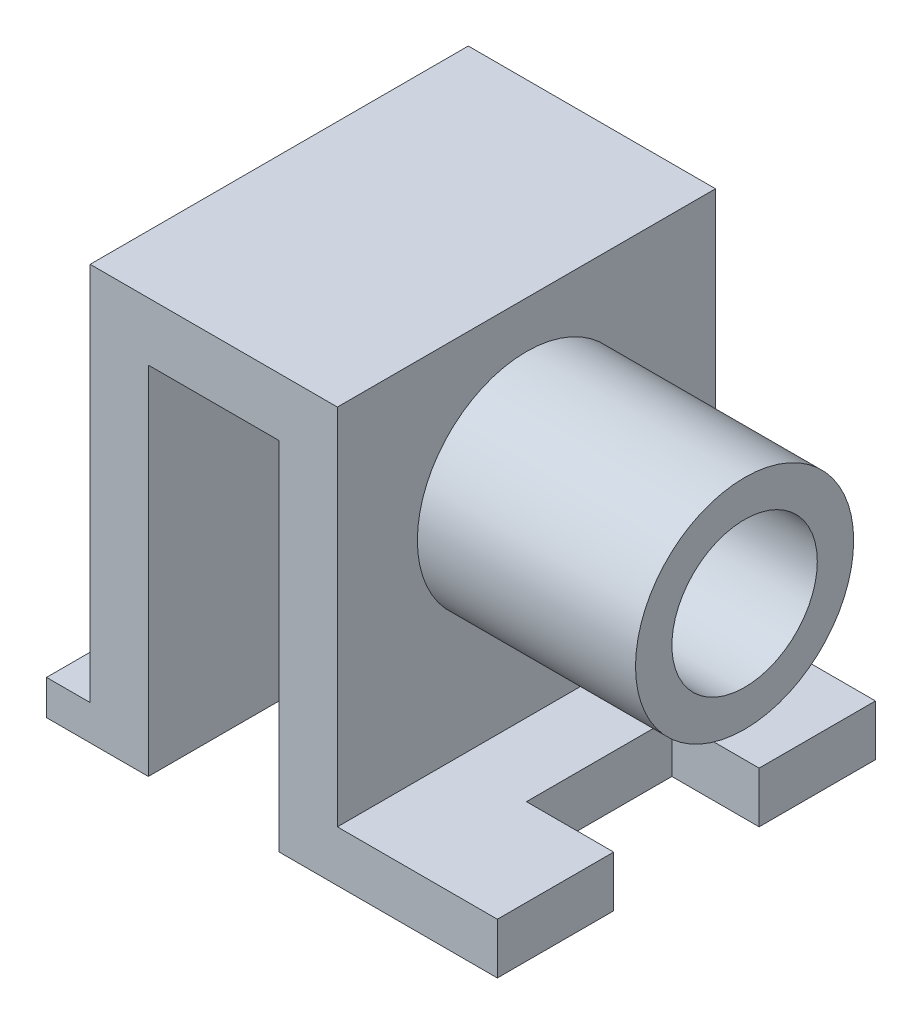
ISO-10303-21;
HEADER;
FILE_DESCRIPTION(('STEP AP214'),'2;1');
FILE_NAME('part.step','',(''),(''),'','','');
FILE_SCHEMA(('AUTOMOTIVE_DESIGN { 1 0 10303 214 1 1 1 1 }'));
ENDSEC;
DATA;
#1=APPLICATION_CONTEXT('core data for automotive mechanical design processes');
#2=APPLICATION_PROTOCOL_DEFINITION('international standard','automotive_design',2000,#1);
#3=PRODUCT_CONTEXT('',#1,'mechanical');
#4=PRODUCT('Part','Part','',(#3));
#5=PRODUCT_RELATED_PRODUCT_CATEGORY('part','',(#4));
#6=PRODUCT_DEFINITION_FORMATION('','',#4);
#7=PRODUCT_DEFINITION_CONTEXT('part definition',#1,'design');
#8=PRODUCT_DEFINITION('design','',#6,#7);
#9=PRODUCT_DEFINITION_SHAPE('','',#8);
#10=(LENGTH_UNIT() NAMED_UNIT(*) SI_UNIT(.MILLI.,.METRE.));
#11=(NAMED_UNIT(*) PLANE_ANGLE_UNIT() SI_UNIT($,.RADIAN.));
#12=(NAMED_UNIT(*) SI_UNIT($,.STERADIAN.) SOLID_ANGLE_UNIT());
#13=UNCERTAINTY_MEASURE_WITH_UNIT(LENGTH_MEASURE(1.E-05),#10,'distance_accuracy_value','');
#14=(GEOMETRIC_REPRESENTATION_CONTEXT(3) GLOBAL_UNCERTAINTY_ASSIGNED_CONTEXT((#13)) GLOBAL_UNIT_ASSIGNED_CONTEXT((#10,
#11,#12)) REPRESENTATION_CONTEXT('',''));
#15=CARTESIAN_POINT('',(0.,0.,0.));
#16=DIRECTION('',(0.,0.,1.));
#17=DIRECTION('',(1.,0.,0.));
#18=AXIS2_PLACEMENT_3D('',#15,#16,#17);
#19=CARTESIAN_POINT('',(62.,0.,26.));
#20=DIRECTION('',(-1.,0.,0.));
#21=DIRECTION('',(0.,0.,1.));
#22=AXIS2_PLACEMENT_3D('',#19,#20,#21);
#23=PLANE('',#22);
#24=DIRECTION('',(0.,0.,-1.));
#25=VECTOR('',#24,1.);
#26=CARTESIAN_POINT('',(62.,0.,26.));
#27=LINE('',#26,#25);
#28=CARTESIAN_POINT('',(62.,0.,26.));
#29=VERTEX_POINT('',#28);
#30=CARTESIAN_POINT('',(62.,0.,10.));
#31=VERTEX_POINT('',#30);
#32=EDGE_CURVE('E211',#29,#31,#27,.T.);
#33=ORIENTED_EDGE('',*,*,#32,.T.);
#34=DIRECTION('',(0.,1.,0.));
#35=VECTOR('',#34,1.);
#36=CARTESIAN_POINT('',(62.,0.,10.));
#37=LINE('',#36,#35);
#38=CARTESIAN_POINT('',(62.,7.,10.));
#39=VERTEX_POINT('',#38);
#40=EDGE_CURVE('E177',#31,#39,#37,.T.);
#41=ORIENTED_EDGE('',*,*,#40,.T.);
#42=DIRECTION('',(0.,0.,-1.));
#43=VECTOR('',#42,1.);
#44=CARTESIAN_POINT('',(62.,7.,26.));
#45=LINE('',#44,#43);
#46=CARTESIAN_POINT('',(62.,7.,26.));
#47=VERTEX_POINT('',#46);
#48=EDGE_CURVE('E207',#47,#39,#45,.T.);
#49=ORIENTED_EDGE('',*,*,#48,.F.);
#50=DIRECTION('',(0.,1.,0.));
#51=VECTOR('',#50,1.);
#52=CARTESIAN_POINT('',(62.,0.,26.));
#53=LINE('',#52,#51);
#54=EDGE_CURVE('E254',#29,#47,#53,.T.);
#55=ORIENTED_EDGE('',*,*,#54,.F.);
#56=EDGE_LOOP('',(#33,#41,#49,#55));
#57=FACE_BOUND('',#56,.T.);
#58=ADVANCED_FACE('F39',(#57),#23,.F.);
#59=CARTESIAN_POINT('',(0.,4.80451127819548,26.));
#60=DIRECTION('',(1.,0.,0.));
#61=DIRECTION('',(0.,0.,-1.));
#62=AXIS2_PLACEMENT_3D('',#59,#60,#61);
#63=PLANE('',#62);
#64=DIRECTION('',(0.,-1.,0.));
#65=VECTOR('',#64,1.);
#66=CARTESIAN_POINT('',(0.,4.80451127819548,-26.));
#67=LINE('',#66,#65);
#68=CARTESIAN_POINT('',(0.,4.80451127819548,-26.));
#69=VERTEX_POINT('',#68);
#70=CARTESIAN_POINT('',(0.,0.,-26.));
#71=VERTEX_POINT('',#70);
#72=EDGE_CURVE('E173',#69,#71,#67,.T.);
#73=ORIENTED_EDGE('',*,*,#72,.T.);
#74=DIRECTION('',(0.,0.,-1.));
#75=VECTOR('',#74,1.);
#76=CARTESIAN_POINT('',(0.,0.,26.));
#77=LINE('',#76,#75);
#78=CARTESIAN_POINT('',(0.,0.,26.));
#79=VERTEX_POINT('',#78);
#80=EDGE_CURVE('E47',#79,#71,#77,.T.);
#81=ORIENTED_EDGE('',*,*,#80,.F.);
#82=DIRECTION('',(0.,-1.,0.));
#83=VECTOR('',#82,1.);
#84=CARTESIAN_POINT('',(0.,4.80451127819548,26.));
#85=LINE('',#84,#83);
#86=CARTESIAN_POINT('',(0.,4.80451127819548,26.));
#87=VERTEX_POINT('',#86);
#88=EDGE_CURVE('E199',#87,#79,#85,.T.);
#89=ORIENTED_EDGE('',*,*,#88,.F.);
#90=DIRECTION('',(0.,0.,-1.));
#91=VECTOR('',#90,1.);
#92=CARTESIAN_POINT('',(0.,4.80451127819548,26.));
#93=LINE('',#92,#91);
#94=EDGE_CURVE('E169',#87,#69,#93,.T.);
#95=ORIENTED_EDGE('',*,*,#94,.T.);
#96=EDGE_LOOP('',(#73,#81,#89,#95));
#97=FACE_BOUND('',#96,.T.);
#98=ADVANCED_FACE('F41',(#97),#63,.F.);
#99=CARTESIAN_POINT('',(0.,0.,26.));
#100=DIRECTION('',(0.,1.,0.));
#101=DIRECTION('',(-1.,0.,0.));
#102=AXIS2_PLACEMENT_3D('',#99,#100,#101);
#103=PLANE('',#102);
#104=DIRECTION('',(1.,0.,0.));
#105=VECTOR('',#104,1.);
#106=CARTESIAN_POINT('',(0.,0.,-26.));
#107=LINE('',#106,#105);
#108=CARTESIAN_POINT('',(14.,0.,-26.));
#109=VERTEX_POINT('',#108);
#110=EDGE_CURVE('E176',#71,#109,#107,.T.);
#111=ORIENTED_EDGE('',*,*,#110,.T.);
#112=DIRECTION('',(0.,0.,-1.));
#113=VECTOR('',#112,1.);
#114=CARTESIAN_POINT('',(14.,0.,26.));
#115=LINE('',#114,#113);
#116=CARTESIAN_POINT('',(14.,0.,26.));
#117=VERTEX_POINT('',#116);
#118=EDGE_CURVE('E223',#117,#109,#115,.T.);
#119=ORIENTED_EDGE('',*,*,#118,.F.);
#120=DIRECTION('',(1.,0.,0.));
#121=VECTOR('',#120,1.);
#122=CARTESIAN_POINT('',(0.,0.,26.));
#123=LINE('',#122,#121);
#124=EDGE_CURVE('E117',#79,#117,#123,.T.);
#125=ORIENTED_EDGE('',*,*,#124,.F.);
#126=ORIENTED_EDGE('',*,*,#80,.T.);
#127=EDGE_LOOP('',(#111,#119,#125,#126));
#128=FACE_BOUND('',#127,.T.);
#129=ADVANCED_FACE('F226',(#128),#103,.F.);
#130=CARTESIAN_POINT('',(14.,0.,26.));
#131=DIRECTION('',(-1.,0.,0.));
#132=DIRECTION('',(0.,0.,1.));
#133=AXIS2_PLACEMENT_3D('',#130,#131,#132);
#134=PLANE('',#133);
#135=DIRECTION('',(0.,1.,0.));
#136=VECTOR('',#135,1.);
#137=CARTESIAN_POINT('',(14.,0.,-26.));
#138=LINE('',#137,#136);
#139=CARTESIAN_POINT('',(14.,49.,-26.));
#140=VERTEX_POINT('',#139);
#141=EDGE_CURVE('E179',#109,#140,#138,.T.);
#142=ORIENTED_EDGE('',*,*,#141,.T.);
#143=DIRECTION('',(0.,0.,-1.));
#144=VECTOR('',#143,1.);
#145=CARTESIAN_POINT('',(14.,49.,26.));
#146=LINE('',#145,#144);
#147=CARTESIAN_POINT('',(14.,49.,26.));
#148=VERTEX_POINT('',#147);
#149=EDGE_CURVE('E220',#148,#140,#146,.T.);
#150=ORIENTED_EDGE('',*,*,#149,.F.);
#151=DIRECTION('',(0.,1.,0.));
#152=VECTOR('',#151,1.);
#153=CARTESIAN_POINT('',(14.,0.,26.));
#154=LINE('',#153,#152);
#155=EDGE_CURVE('E246',#117,#148,#154,.T.);
#156=ORIENTED_EDGE('',*,*,#155,.F.);
#157=ORIENTED_EDGE('',*,*,#118,.T.);
#158=EDGE_LOOP('',(#142,#150,#156,#157));
#159=FACE_BOUND('',#158,.T.);
#160=ADVANCED_FACE('F237',(#159),#134,.F.);
#161=CARTESIAN_POINT('',(14.,49.,26.));
#162=DIRECTION('',(0.,1.,0.));
#163=DIRECTION('',(0.,0.,1.));
#164=AXIS2_PLACEMENT_3D('',#161,#162,#163);
#165=PLANE('',#164);
#166=DIRECTION('',(1.,0.,0.));
#167=VECTOR('',#166,1.);
#168=CARTESIAN_POINT('',(14.,49.,-26.));
#169=LINE('',#168,#167);
#170=CARTESIAN_POINT('',(32.,49.,-26.));
#171=VERTEX_POINT('',#170);
#172=EDGE_CURVE('E181',#140,#171,#169,.T.);
#173=ORIENTED_EDGE('',*,*,#172,.T.);
#174=DIRECTION('',(0.,0.,-1.));
#175=VECTOR('',#174,1.);
#176=CARTESIAN_POINT('',(32.,49.,26.));
#177=LINE('',#176,#175);
#178=CARTESIAN_POINT('',(32.,49.,26.));
#179=VERTEX_POINT('',#178);
#180=EDGE_CURVE('E217',#179,#171,#177,.T.);
#181=ORIENTED_EDGE('',*,*,#180,.F.);
#182=DIRECTION('',(1.,0.,0.));
#183=VECTOR('',#182,1.);
#184=CARTESIAN_POINT('',(14.,49.,26.));
#185=LINE('',#184,#183);
#186=EDGE_CURVE('E243',#148,#179,#185,.T.);
#187=ORIENTED_EDGE('',*,*,#186,.F.);
#188=ORIENTED_EDGE('',*,*,#149,.T.);
#189=EDGE_LOOP('',(#173,#181,#187,#188));
#190=FACE_BOUND('',#189,.T.);
#191=ADVANCED_FACE('F241',(#190),#165,.F.);
#192=CARTESIAN_POINT('',(32.,49.,26.));
#193=DIRECTION('',(1.,0.,0.));
#194=DIRECTION('',(0.,1.,0.));
#195=AXIS2_PLACEMENT_3D('',#192,#193,#194);
#196=PLANE('',#195);
#197=DIRECTION('',(0.,-1.,0.));
#198=VECTOR('',#197,1.);
#199=CARTESIAN_POINT('',(32.,49.,-26.));
#200=LINE('',#199,#198);
#201=CARTESIAN_POINT('',(32.,0.,-26.));
#202=VERTEX_POINT('',#201);
#203=EDGE_CURVE('E183',#171,#202,#200,.T.);
#204=ORIENTED_EDGE('',*,*,#203,.T.);
#205=DIRECTION('',(0.,0.,-1.));
#206=VECTOR('',#205,1.);
#207=CARTESIAN_POINT('',(32.,0.,26.));
#208=LINE('',#207,#206);
#209=CARTESIAN_POINT('',(32.,0.,26.));
#210=VERTEX_POINT('',#209);
#211=EDGE_CURVE('E214',#210,#202,#208,.T.);
#212=ORIENTED_EDGE('',*,*,#211,.F.);
#213=DIRECTION('',(0.,-1.,0.));
#214=VECTOR('',#213,1.);
#215=CARTESIAN_POINT('',(32.,49.,26.));
#216=LINE('',#215,#214);
#217=EDGE_CURVE('E245',#179,#210,#216,.T.);
#218=ORIENTED_EDGE('',*,*,#217,.F.);
#219=ORIENTED_EDGE('',*,*,#180,.T.);
#220=EDGE_LOOP('',(#204,#212,#218,#219));
#221=FACE_BOUND('',#220,.T.);
#222=ADVANCED_FACE('F342',(#221),#196,.F.);
#223=CARTESIAN_POINT('',(32.,0.,26.));
#224=DIRECTION('',(0.,1.,0.));
#225=DIRECTION('',(-1.,0.,0.));
#226=AXIS2_PLACEMENT_3D('',#223,#224,#225);
#227=PLANE('',#226);
#228=DIRECTION('',(0.,0.,1.));
#229=VECTOR('',#228,1.);
#230=CARTESIAN_POINT('',(50.,0.,-10.));
#231=LINE('',#230,#229);
#232=CARTESIAN_POINT('',(50.,0.,-10.));
#233=VERTEX_POINT('',#232);
#234=CARTESIAN_POINT('',(50.,0.,10.));
#235=VERTEX_POINT('',#234);
#236=EDGE_CURVE('E292',#233,#235,#231,.T.);
#237=ORIENTED_EDGE('',*,*,#236,.T.);
#238=DIRECTION('',(1.,0.,0.));
#239=VECTOR('',#238,1.);
#240=CARTESIAN_POINT('',(50.,0.,10.));
#241=LINE('',#240,#239);
#242=EDGE_CURVE('E272',#235,#31,#241,.T.);
#243=ORIENTED_EDGE('',*,*,#242,.T.);
#244=ORIENTED_EDGE('',*,*,#32,.F.);
#245=DIRECTION('',(1.,0.,0.));
#246=VECTOR('',#245,1.);
#247=CARTESIAN_POINT('',(32.,0.,26.));
#248=LINE('',#247,#246);
#249=EDGE_CURVE('E248',#210,#29,#248,.T.);
#250=ORIENTED_EDGE('',*,*,#249,.F.);
#251=ORIENTED_EDGE('',*,*,#211,.T.);
#252=DIRECTION('',(1.,0.,0.));
#253=VECTOR('',#252,1.);
#254=CARTESIAN_POINT('',(32.,0.,-26.));
#255=LINE('',#254,#253);
#256=CARTESIAN_POINT('',(62.,0.,-26.));
#257=VERTEX_POINT('',#256);
#258=EDGE_CURVE('E185',#202,#257,#255,.T.);
#259=ORIENTED_EDGE('',*,*,#258,.T.);
#260=CARTESIAN_POINT('',(62.,0.,-10.));
#261=VERTEX_POINT('',#260);
#262=EDGE_CURVE('E210',#261,#257,#27,.T.);
#263=ORIENTED_EDGE('',*,*,#262,.F.);
#264=DIRECTION('',(-1.,0.,0.));
#265=VECTOR('',#264,1.);
#266=CARTESIAN_POINT('',(62.,0.,-10.));
#267=LINE('',#266,#265);
#268=EDGE_CURVE('E283',#261,#233,#267,.T.);
#269=ORIENTED_EDGE('',*,*,#268,.T.);
#270=EDGE_LOOP('',(#237,#243,#244,#250,#251,#259,#263,#269));
#271=FACE_BOUND('',#270,.T.);
#272=ADVANCED_FACE('F337',(#271),#227,.F.);
#273=CARTESIAN_POINT('',(62.,7.,-9.99999999999998));
#274=VERTEX_POINT('',#273);
#275=CARTESIAN_POINT('',(62.,7.,-26.));
#276=VERTEX_POINT('',#275);
#277=EDGE_CURVE('E206',#274,#276,#45,.T.);
#278=ORIENTED_EDGE('',*,*,#277,.F.);
#279=DIRECTION('',(0.,1.,0.));
#280=VECTOR('',#279,1.);
#281=CARTESIAN_POINT('',(62.,0.,-10.));
#282=LINE('',#281,#280);
#283=EDGE_CURVE('E54',#261,#274,#282,.T.);
#284=ORIENTED_EDGE('',*,*,#283,.F.);
#285=ORIENTED_EDGE('',*,*,#262,.T.);
#286=DIRECTION('',(0.,1.,0.));
#287=VECTOR('',#286,1.);
#288=CARTESIAN_POINT('',(62.,0.,-26.));
#289=LINE('',#288,#287);
#290=EDGE_CURVE('E188',#257,#276,#289,.T.);
#291=ORIENTED_EDGE('',*,*,#290,.T.);
#292=EDGE_LOOP('',(#278,#284,#285,#291));
#293=FACE_BOUND('',#292,.T.);
#294=ADVANCED_FACE('F328',(#293),#23,.F.);
#295=CARTESIAN_POINT('',(62.,7.,26.));
#296=DIRECTION('',(0.,-1.,0.));
#297=DIRECTION('',(1.,0.,0.));
#298=AXIS2_PLACEMENT_3D('',#295,#296,#297);
#299=PLANE('',#298);
#300=ORIENTED_EDGE('',*,*,#48,.T.);
#301=DIRECTION('',(1.,0.,0.));
#302=VECTOR('',#301,1.);
#303=CARTESIAN_POINT('',(50.,7.,10.));
#304=LINE('',#303,#302);
#305=CARTESIAN_POINT('',(50.,7.,10.));
#306=VERTEX_POINT('',#305);
#307=EDGE_CURVE('E280',#306,#39,#304,.T.);
#308=ORIENTED_EDGE('',*,*,#307,.F.);
#309=DIRECTION('',(0.,0.,1.));
#310=VECTOR('',#309,1.);
#311=CARTESIAN_POINT('',(50.,7.,-10.));
#312=LINE('',#311,#310);
#313=CARTESIAN_POINT('',(50.,7.,-10.));
#314=VERTEX_POINT('',#313);
#315=EDGE_CURVE('E284',#314,#306,#312,.T.);
#316=ORIENTED_EDGE('',*,*,#315,.F.);
#317=DIRECTION('',(-1.,0.,0.));
#318=VECTOR('',#317,1.);
#319=CARTESIAN_POINT('',(62.,7.,-10.));
#320=LINE('',#319,#318);
#321=EDGE_CURVE('E287',#274,#314,#320,.T.);
#322=ORIENTED_EDGE('',*,*,#321,.F.);
#323=ORIENTED_EDGE('',*,*,#277,.T.);
#324=DIRECTION('',(-1.,0.,0.));
#325=VECTOR('',#324,1.);
#326=CARTESIAN_POINT('',(62.,7.,-26.));
#327=LINE('',#326,#325);
#328=CARTESIAN_POINT('',(40.,7.,-26.));
#329=VERTEX_POINT('',#328);
#330=EDGE_CURVE('E191',#276,#329,#327,.T.);
#331=ORIENTED_EDGE('',*,*,#330,.T.);
#332=DIRECTION('',(0.,0.,-1.));
#333=VECTOR('',#332,1.);
#334=CARTESIAN_POINT('',(40.,7.,26.));
#335=LINE('',#334,#333);
#336=CARTESIAN_POINT('',(40.,7.,26.));
#337=VERTEX_POINT('',#336);
#338=EDGE_CURVE('E203',#337,#329,#335,.T.);
#339=ORIENTED_EDGE('',*,*,#338,.F.);
#340=DIRECTION('',(-1.,0.,0.));
#341=VECTOR('',#340,1.);
#342=CARTESIAN_POINT('',(62.,7.,26.));
#343=LINE('',#342,#341);
#344=EDGE_CURVE('E256',#47,#337,#343,.T.);
#345=ORIENTED_EDGE('',*,*,#344,.F.);
#346=EDGE_LOOP('',(#300,#308,#316,#322,#323,#331,#339,#345));
#347=FACE_BOUND('',#346,.T.);
#348=ADVANCED_FACE('F262',(#347),#299,.F.);
#349=CARTESIAN_POINT('',(40.,7.,26.));
#350=DIRECTION('',(-1.,0.,0.));
#351=DIRECTION('',(0.,0.,1.));
#352=AXIS2_PLACEMENT_3D('',#349,#350,#351);
#353=PLANE('',#352);
#354=CARTESIAN_POINT('',(40.,35.6099255133953,0.));
#355=DIRECTION('',(-1.,0.,0.));
#356=DIRECTION('',(0.,0.,1.));
#357=AXIS2_PLACEMENT_3D('',#354,#355,#356);
#358=CIRCLE('',#357,15.);
#359=CARTESIAN_POINT('',(40.,35.6099255133953,15.));
#360=VERTEX_POINT('',#359);
#361=EDGE_CURVE('E11',#360,#360,#358,.F.);
#362=ORIENTED_EDGE('',*,*,#361,.F.);
#363=EDGE_LOOP('',(#362));
#364=FACE_BOUND('',#363,.T.);
#365=DIRECTION('',(0.,1.,0.));
#366=VECTOR('',#365,1.);
#367=CARTESIAN_POINT('',(40.,7.,-26.));
#368=LINE('',#367,#366);
#369=CARTESIAN_POINT('',(40.,57.,-26.));
#370=VERTEX_POINT('',#369);
#371=EDGE_CURVE('E193',#329,#370,#368,.T.);
#372=ORIENTED_EDGE('',*,*,#371,.T.);
#373=DIRECTION('',(0.,0.,-1.));
#374=VECTOR('',#373,1.);
#375=CARTESIAN_POINT('',(40.,57.,26.));
#376=LINE('',#375,#374);
#377=CARTESIAN_POINT('',(40.,57.,26.));
#378=VERTEX_POINT('',#377);
#379=EDGE_CURVE('E164',#378,#370,#376,.T.);
#380=ORIENTED_EDGE('',*,*,#379,.F.);
#381=DIRECTION('',(0.,1.,0.));
#382=VECTOR('',#381,1.);
#383=CARTESIAN_POINT('',(40.,7.,26.));
#384=LINE('',#383,#382);
#385=EDGE_CURVE('E152',#337,#378,#384,.T.);
#386=ORIENTED_EDGE('',*,*,#385,.F.);
#387=ORIENTED_EDGE('',*,*,#338,.T.);
#388=EDGE_LOOP('',(#372,#380,#386,#387));
#389=FACE_BOUND('',#388,.T.);
#390=ADVANCED_FACE('F266',(#364,#389),#353,.F.);
#391=CARTESIAN_POINT('',(40.,57.,26.));
#392=DIRECTION('',(0.,-1.,0.));
#393=DIRECTION('',(0.,0.,-1.));
#394=AXIS2_PLACEMENT_3D('',#391,#392,#393);
#395=PLANE('',#394);
#396=DIRECTION('',(-1.,0.,0.));
#397=VECTOR('',#396,1.);
#398=CARTESIAN_POINT('',(40.,57.,-26.));
#399=LINE('',#398,#397);
#400=CARTESIAN_POINT('',(6.,57.,-26.));
#401=VERTEX_POINT('',#400);
#402=EDGE_CURVE('E161',#370,#401,#399,.T.);
#403=ORIENTED_EDGE('',*,*,#402,.T.);
#404=DIRECTION('',(0.,0.,-1.));
#405=VECTOR('',#404,1.);
#406=CARTESIAN_POINT('',(6.,57.,26.));
#407=LINE('',#406,#405);
#408=CARTESIAN_POINT('',(6.,57.,26.));
#409=VERTEX_POINT('',#408);
#410=EDGE_CURVE('E158',#409,#401,#407,.T.);
#411=ORIENTED_EDGE('',*,*,#410,.F.);
#412=DIRECTION('',(-1.,0.,0.));
#413=VECTOR('',#412,1.);
#414=CARTESIAN_POINT('',(40.,57.,26.));
#415=LINE('',#414,#413);
#416=EDGE_CURVE('E145',#378,#409,#415,.T.);
#417=ORIENTED_EDGE('',*,*,#416,.F.);
#418=ORIENTED_EDGE('',*,*,#379,.T.);
#419=EDGE_LOOP('',(#403,#411,#417,#418));
#420=FACE_BOUND('',#419,.T.);
#421=ADVANCED_FACE('F159',(#420),#395,.F.);
#422=CARTESIAN_POINT('',(6.,57.,26.));
#423=DIRECTION('',(1.,0.,0.));
#424=DIRECTION('',(0.,1.,0.));
#425=AXIS2_PLACEMENT_3D('',#422,#423,#424);
#426=PLANE('',#425);
#427=DIRECTION('',(0.,-1.,0.));
#428=VECTOR('',#427,1.);
#429=CARTESIAN_POINT('',(6.,57.,-26.));
#430=LINE('',#429,#428);
#431=CARTESIAN_POINT('',(6.,4.80451127819548,-26.));
#432=VERTEX_POINT('',#431);
#433=EDGE_CURVE('E196',#401,#432,#430,.T.);
#434=ORIENTED_EDGE('',*,*,#433,.T.);
#435=DIRECTION('',(0.,0.,-1.));
#436=VECTOR('',#435,1.);
#437=CARTESIAN_POINT('',(6.,4.80451127819548,26.));
#438=LINE('',#437,#436);
#439=CARTESIAN_POINT('',(6.,4.80451127819548,26.));
#440=VERTEX_POINT('',#439);
#441=EDGE_CURVE('E165',#440,#432,#438,.T.);
#442=ORIENTED_EDGE('',*,*,#441,.F.);
#443=DIRECTION('',(0.,-1.,0.));
#444=VECTOR('',#443,1.);
#445=CARTESIAN_POINT('',(6.,57.,26.));
#446=LINE('',#445,#444);
#447=EDGE_CURVE('E149',#409,#440,#446,.T.);
#448=ORIENTED_EDGE('',*,*,#447,.F.);
#449=ORIENTED_EDGE('',*,*,#410,.T.);
#450=EDGE_LOOP('',(#434,#442,#448,#449));
#451=FACE_BOUND('',#450,.T.);
#452=ADVANCED_FACE('F167',(#451),#426,.F.);
#453=CARTESIAN_POINT('',(6.,4.80451127819548,26.));
#454=DIRECTION('',(0.,-1.,0.));
#455=DIRECTION('',(0.,0.,-1.));
#456=AXIS2_PLACEMENT_3D('',#453,#454,#455);
#457=PLANE('',#456);
#458=DIRECTION('',(-1.,0.,0.));
#459=VECTOR('',#458,1.);
#460=CARTESIAN_POINT('',(6.,4.80451127819548,-26.));
#461=LINE('',#460,#459);
#462=EDGE_CURVE('E108',#432,#69,#461,.T.);
#463=ORIENTED_EDGE('',*,*,#462,.T.);
#464=ORIENTED_EDGE('',*,*,#94,.F.);
#465=DIRECTION('',(-1.,0.,0.));
#466=VECTOR('',#465,1.);
#467=CARTESIAN_POINT('',(6.,4.80451127819548,26.));
#468=LINE('',#467,#466);
#469=EDGE_CURVE('E63',#440,#87,#468,.T.);
#470=ORIENTED_EDGE('',*,*,#469,.F.);
#471=ORIENTED_EDGE('',*,*,#441,.T.);
#472=EDGE_LOOP('',(#463,#464,#470,#471));
#473=FACE_BOUND('',#472,.T.);
#474=ADVANCED_FACE('F267',(#473),#457,.F.);
#475=CARTESIAN_POINT('',(0.,0.,26.));
#476=DIRECTION('',(0.,0.,1.));
#477=DIRECTION('',(1.,0.,0.));
#478=AXIS2_PLACEMENT_3D('',#475,#476,#477);
#479=PLANE('',#478);
#480=ORIENTED_EDGE('',*,*,#88,.T.);
#481=ORIENTED_EDGE('',*,*,#124,.T.);
#482=ORIENTED_EDGE('',*,*,#155,.T.);
#483=ORIENTED_EDGE('',*,*,#186,.T.);
#484=ORIENTED_EDGE('',*,*,#217,.T.);
#485=ORIENTED_EDGE('',*,*,#249,.T.);
#486=ORIENTED_EDGE('',*,*,#54,.T.);
#487=ORIENTED_EDGE('',*,*,#344,.T.);
#488=ORIENTED_EDGE('',*,*,#385,.T.);
#489=ORIENTED_EDGE('',*,*,#416,.T.);
#490=ORIENTED_EDGE('',*,*,#447,.T.);
#491=ORIENTED_EDGE('',*,*,#469,.T.);
#492=EDGE_LOOP('',(#480,#481,#482,#483,#484,#485,#486,#487,#488,#489,#490,#491));
#493=FACE_BOUND('',#492,.T.);
#494=ADVANCED_FACE('F147',(#493),#479,.T.);
#495=CARTESIAN_POINT('',(0.,0.,-26.));
#496=DIRECTION('',(0.,0.,1.));
#497=DIRECTION('',(1.,0.,0.));
#498=AXIS2_PLACEMENT_3D('',#495,#496,#497);
#499=PLANE('',#498);
#500=ORIENTED_EDGE('',*,*,#72,.F.);
#501=ORIENTED_EDGE('',*,*,#462,.F.);
#502=ORIENTED_EDGE('',*,*,#433,.F.);
#503=ORIENTED_EDGE('',*,*,#402,.F.);
#504=ORIENTED_EDGE('',*,*,#371,.F.);
#505=ORIENTED_EDGE('',*,*,#330,.F.);
#506=ORIENTED_EDGE('',*,*,#290,.F.);
#507=ORIENTED_EDGE('',*,*,#258,.F.);
#508=ORIENTED_EDGE('',*,*,#203,.F.);
#509=ORIENTED_EDGE('',*,*,#172,.F.);
#510=ORIENTED_EDGE('',*,*,#141,.F.);
#511=ORIENTED_EDGE('',*,*,#110,.F.);
#512=EDGE_LOOP('',(#500,#501,#502,#503,#504,#505,#506,#507,#508,#509,#510,#511));
#513=FACE_BOUND('',#512,.T.);
#514=ADVANCED_FACE('F231',(#513),#499,.F.);
#515=CARTESIAN_POINT('',(50.,0.,10.));
#516=DIRECTION('',(0.,0.,1.));
#517=DIRECTION('',(1.,0.,0.));
#518=AXIS2_PLACEMENT_3D('',#515,#516,#517);
#519=PLANE('',#518);
#520=ORIENTED_EDGE('',*,*,#307,.T.);
#521=ORIENTED_EDGE('',*,*,#40,.F.);
#522=ORIENTED_EDGE('',*,*,#242,.F.);
#523=DIRECTION('',(0.,1.,0.));
#524=VECTOR('',#523,1.);
#525=CARTESIAN_POINT('',(50.,0.,10.));
#526=LINE('',#525,#524);
#527=EDGE_CURVE('E275',#235,#306,#526,.T.);
#528=ORIENTED_EDGE('',*,*,#527,.T.);
#529=EDGE_LOOP('',(#520,#521,#522,#528));
#530=FACE_BOUND('',#529,.T.);
#531=ADVANCED_FACE('F365',(#530),#519,.F.);
#532=CARTESIAN_POINT('',(50.,0.,-10.));
#533=DIRECTION('',(-1.,0.,0.));
#534=DIRECTION('',(0.,-1.,0.));
#535=AXIS2_PLACEMENT_3D('',#532,#533,#534);
#536=PLANE('',#535);
#537=ORIENTED_EDGE('',*,*,#315,.T.);
#538=ORIENTED_EDGE('',*,*,#527,.F.);
#539=ORIENTED_EDGE('',*,*,#236,.F.);
#540=DIRECTION('',(0.,1.,0.));
#541=VECTOR('',#540,1.);
#542=CARTESIAN_POINT('',(50.,0.,-10.));
#543=LINE('',#542,#541);
#544=EDGE_CURVE('E271',#233,#314,#543,.T.);
#545=ORIENTED_EDGE('',*,*,#544,.T.);
#546=EDGE_LOOP('',(#537,#538,#539,#545));
#547=FACE_BOUND('',#546,.T.);
#548=ADVANCED_FACE('F322',(#547),#536,.F.);
#549=CARTESIAN_POINT('',(62.,0.,-10.));
#550=DIRECTION('',(0.,0.,-1.));
#551=DIRECTION('',(-1.,0.,0.));
#552=AXIS2_PLACEMENT_3D('',#549,#550,#551);
#553=PLANE('',#552);
#554=ORIENTED_EDGE('',*,*,#321,.T.);
#555=ORIENTED_EDGE('',*,*,#544,.F.);
#556=ORIENTED_EDGE('',*,*,#268,.F.);
#557=ORIENTED_EDGE('',*,*,#283,.T.);
#558=EDGE_LOOP('',(#554,#555,#556,#557));
#559=FACE_BOUND('',#558,.T.);
#560=ADVANCED_FACE('F312',(#559),#553,.F.);
#561=CARTESIAN_POINT('',(70.,35.6099255133953,0.));
#562=DIRECTION('',(1.,0.,0.));
#563=DIRECTION('',(0.,0.,-1.));
#564=AXIS2_PLACEMENT_3D('',#561,#562,#563);
#565=PLANE('',#564);
#566=CARTESIAN_POINT('',(70.,35.6099255133953,0.));
#567=DIRECTION('',(1.,0.,0.));
#568=DIRECTION('',(0.,0.,-1.));
#569=AXIS2_PLACEMENT_3D('',#566,#567,#568);
#570=CIRCLE('',#569,15.);
#571=CARTESIAN_POINT('',(70.,35.6099255133953,-15.));
#572=VERTEX_POINT('',#571);
#573=EDGE_CURVE('E289',#572,#572,#570,.T.);
#574=ORIENTED_EDGE('',*,*,#573,.T.);
#575=EDGE_LOOP('',(#574));
#576=FACE_BOUND('',#575,.T.);
#577=CARTESIAN_POINT('',(70.,35.6099255133953,0.));
#578=DIRECTION('',(1.,0.,0.));
#579=DIRECTION('',(0.,0.,-1.));
#580=AXIS2_PLACEMENT_3D('',#577,#578,#579);
#581=CIRCLE('',#580,10.);
#582=CARTESIAN_POINT('',(70.,35.6099255133953,-10.));
#583=VERTEX_POINT('',#582);
#584=EDGE_CURVE('E299',#583,#583,#581,.T.);
#585=ORIENTED_EDGE('',*,*,#584,.F.);
#586=EDGE_LOOP('',(#585));
#587=FACE_BOUND('',#586,.T.);
#588=ADVANCED_FACE('F309',(#576,#587),#565,.T.);
#589=CARTESIAN_POINT('',(70.,35.6099255133953,0.));
#590=DIRECTION('',(-1.,0.,0.));
#591=DIRECTION('',(0.,0.,1.));
#592=AXIS2_PLACEMENT_3D('',#589,#590,#591);
#593=CYLINDRICAL_SURFACE('',#592,15.);
#594=ORIENTED_EDGE('',*,*,#573,.F.);
#595=EDGE_LOOP('',(#594));
#596=FACE_BOUND('',#595,.T.);
#597=ORIENTED_EDGE('',*,*,#361,.T.);
#598=EDGE_LOOP('',(#597));
#599=FACE_BOUND('',#598,.T.);
#600=ADVANCED_FACE('F311',(#596,#599),#593,.T.);
#601=CARTESIAN_POINT('',(70.,35.6099255133953,0.));
#602=DIRECTION('',(-1.,0.,0.));
#603=DIRECTION('',(0.,0.,1.));
#604=AXIS2_PLACEMENT_3D('',#601,#602,#603);
#605=CYLINDRICAL_SURFACE('',#604,10.);
#606=ORIENTED_EDGE('',*,*,#584,.T.);
#607=EDGE_LOOP('',(#606));
#608=FACE_BOUND('',#607,.T.);
#609=CARTESIAN_POINT('',(40.,35.6099255133953,0.));
#610=DIRECTION('',(1.,0.,0.));
#611=DIRECTION('',(0.,0.,-1.));
#612=AXIS2_PLACEMENT_3D('',#609,#610,#611);
#613=CIRCLE('',#612,10.);
#614=CARTESIAN_POINT('',(40.,35.6099255133953,-10.));
#615=VERTEX_POINT('',#614);
#616=EDGE_CURVE('E300',#615,#615,#613,.T.);
#617=ORIENTED_EDGE('',*,*,#616,.F.);
#618=EDGE_LOOP('',(#617));
#619=FACE_BOUND('',#618,.T.);
#620=ADVANCED_FACE('F306',(#608,#619),#605,.F.);
#621=ORIENTED_EDGE('',*,*,#616,.T.);
#622=EDGE_LOOP('',(#621));
#623=FACE_BOUND('',#622,.T.);
#624=ADVANCED_FACE('F386',(#623),#353,.F.);
#625=CLOSED_SHELL('',(#58,#98,#129,#160,#191,#222,#272,#294,#348,#390,#421,#452,#474,#494,#514,
#531,#548,#560,#588,#600,#620,#624));
#626=MANIFOLD_SOLID_BREP('B2',#625);
#627=ADVANCED_BREP_SHAPE_REPRESENTATION('',(#18,#626),#14);
#628=SHAPE_DEFINITION_REPRESENTATION(#9,#627);
ENDSEC;
END-ISO-10303-21;
